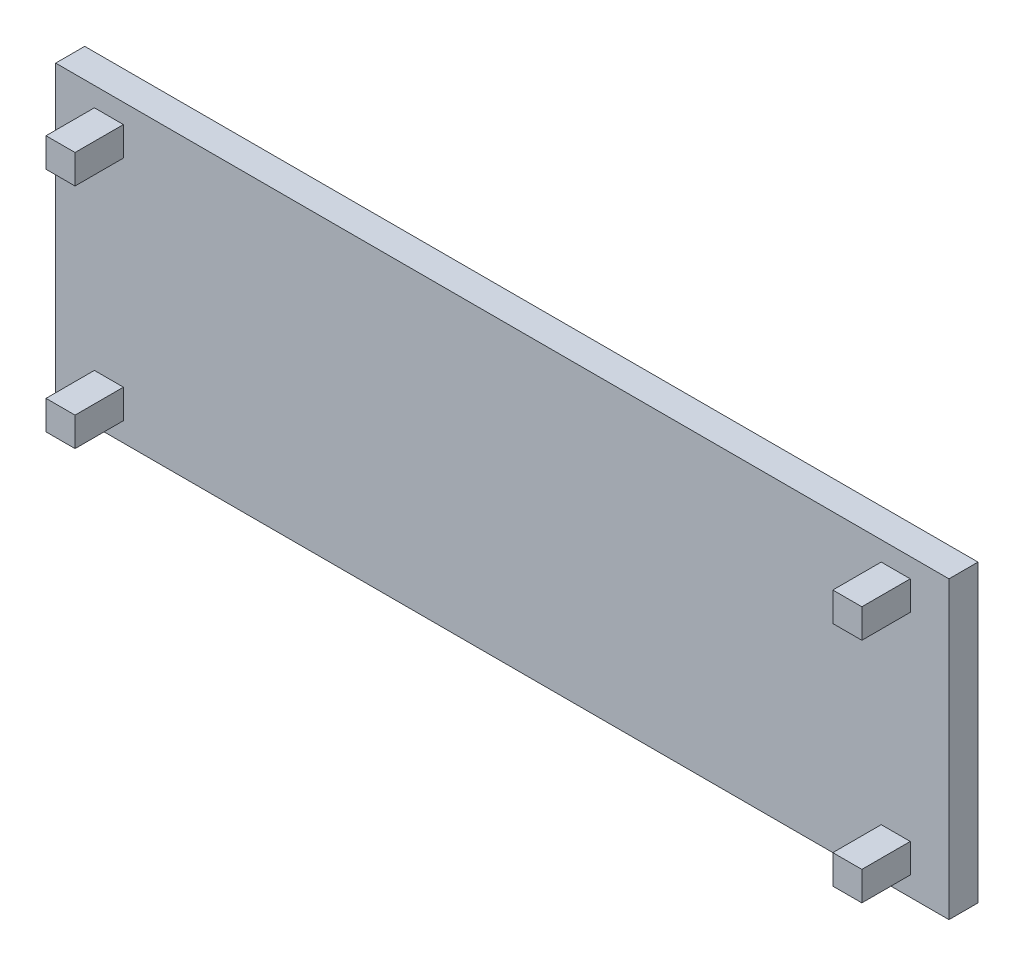
ISO-10303-21;
HEADER;
FILE_DESCRIPTION(('STEP AP214'),'2;1');
FILE_NAME('part.step','',(''),(''),'','','');
FILE_SCHEMA(('AUTOMOTIVE_DESIGN { 1 0 10303 214 1 1 1 1 }'));
ENDSEC;
DATA;
#1=APPLICATION_CONTEXT('core data for automotive mechanical design processes');
#2=APPLICATION_PROTOCOL_DEFINITION('international standard','automotive_design',2000,#1);
#3=PRODUCT_CONTEXT('',#1,'mechanical');
#4=PRODUCT('Part','Part','',(#3));
#5=PRODUCT_RELATED_PRODUCT_CATEGORY('part','',(#4));
#6=PRODUCT_DEFINITION_FORMATION('','',#4);
#7=PRODUCT_DEFINITION_CONTEXT('part definition',#1,'design');
#8=PRODUCT_DEFINITION('design','',#6,#7);
#9=PRODUCT_DEFINITION_SHAPE('','',#8);
#10=(LENGTH_UNIT() NAMED_UNIT(*) SI_UNIT(.MILLI.,.METRE.));
#11=(NAMED_UNIT(*) PLANE_ANGLE_UNIT() SI_UNIT($,.RADIAN.));
#12=(NAMED_UNIT(*) SI_UNIT($,.STERADIAN.) SOLID_ANGLE_UNIT());
#13=UNCERTAINTY_MEASURE_WITH_UNIT(LENGTH_MEASURE(1.E-05),#10,'distance_accuracy_value','');
#14=(GEOMETRIC_REPRESENTATION_CONTEXT(3) GLOBAL_UNCERTAINTY_ASSIGNED_CONTEXT((#13)) GLOBAL_UNIT_ASSIGNED_CONTEXT((#10,
#11,#12)) REPRESENTATION_CONTEXT('',''));
#15=CARTESIAN_POINT('',(0.,0.,0.));
#16=DIRECTION('',(0.,0.,1.));
#17=DIRECTION('',(1.,0.,0.));
#18=AXIS2_PLACEMENT_3D('',#15,#16,#17);
#19=CARTESIAN_POINT('',(0.,0.,3.));
#20=DIRECTION('',(0.,0.,1.));
#21=DIRECTION('',(1.,0.,0.));
#22=AXIS2_PLACEMENT_3D('',#19,#20,#21);
#23=PLANE('',#22);
#24=DIRECTION('',(0.,-1.,0.));
#25=VECTOR('',#24,1.);
#26=CARTESIAN_POINT('',(-46.15,0.,3.));
#27=LINE('',#26,#25);
#28=CARTESIAN_POINT('',(-46.15,15.85,3.));
#29=VERTEX_POINT('',#28);
#30=CARTESIAN_POINT('',(-46.15,-14.65,3.));
#31=VERTEX_POINT('',#30);
#32=EDGE_CURVE('E286',#29,#31,#27,.T.);
#33=ORIENTED_EDGE('',*,*,#32,.T.);
#34=DIRECTION('',(1.,0.,0.));
#35=VECTOR('',#34,1.);
#36=CARTESIAN_POINT('',(0.,-14.65,3.));
#37=LINE('',#36,#35);
#38=CARTESIAN_POINT('',(46.15,-14.65,3.));
#39=VERTEX_POINT('',#38);
#40=EDGE_CURVE('E289',#31,#39,#37,.T.);
#41=ORIENTED_EDGE('',*,*,#40,.T.);
#42=DIRECTION('',(0.,1.,0.));
#43=VECTOR('',#42,1.);
#44=CARTESIAN_POINT('',(46.15,0.,3.));
#45=LINE('',#44,#43);
#46=CARTESIAN_POINT('',(46.15,15.85,3.));
#47=VERTEX_POINT('',#46);
#48=EDGE_CURVE('E292',#39,#47,#45,.T.);
#49=ORIENTED_EDGE('',*,*,#48,.T.);
#50=DIRECTION('',(-1.,0.,0.));
#51=VECTOR('',#50,1.);
#52=CARTESIAN_POINT('',(0.,15.85,3.));
#53=LINE('',#52,#51);
#54=EDGE_CURVE('E294',#47,#29,#53,.T.);
#55=ORIENTED_EDGE('',*,*,#54,.T.);
#56=EDGE_LOOP('',(#33,#41,#49,#55));
#57=FACE_BOUND('',#56,.T.);
#58=DIRECTION('',(-1.,0.,0.));
#59=VECTOR('',#58,1.);
#60=CARTESIAN_POINT('',(42.15,-9.64999999999995,3.));
#61=LINE('',#60,#59);
#62=CARTESIAN_POINT('',(42.15,-9.64999999999995,3.));
#63=VERTEX_POINT('',#62);
#64=CARTESIAN_POINT('',(39.15,-9.64999999999995,3.));
#65=VERTEX_POINT('',#64);
#66=EDGE_CURVE('E270',#63,#65,#61,.T.);
#67=ORIENTED_EDGE('',*,*,#66,.F.);
#68=DIRECTION('',(0.,1.,0.));
#69=VECTOR('',#68,1.);
#70=CARTESIAN_POINT('',(42.15,-12.65,3.));
#71=LINE('',#70,#69);
#72=CARTESIAN_POINT('',(42.15,-12.65,3.));
#73=VERTEX_POINT('',#72);
#74=EDGE_CURVE('E256',#73,#63,#71,.T.);
#75=ORIENTED_EDGE('',*,*,#74,.F.);
#76=DIRECTION('',(1.,0.,0.));
#77=VECTOR('',#76,1.);
#78=CARTESIAN_POINT('',(42.15,-12.65,3.));
#79=LINE('',#78,#77);
#80=CARTESIAN_POINT('',(39.15,-12.65,3.));
#81=VERTEX_POINT('',#80);
#82=EDGE_CURVE('E261',#81,#73,#79,.T.);
#83=ORIENTED_EDGE('',*,*,#82,.F.);
#84=DIRECTION('',(0.,-1.,0.));
#85=VECTOR('',#84,1.);
#86=CARTESIAN_POINT('',(39.15,-12.65,3.));
#87=LINE('',#86,#85);
#88=EDGE_CURVE('E272',#65,#81,#87,.T.);
#89=ORIENTED_EDGE('',*,*,#88,.F.);
#90=EDGE_LOOP('',(#67,#75,#83,#89));
#91=FACE_BOUND('',#90,.T.);
#92=DIRECTION('',(1.,0.,0.));
#93=VECTOR('',#92,1.);
#94=CARTESIAN_POINT('',(-42.15,-12.65,3.));
#95=LINE('',#94,#93);
#96=CARTESIAN_POINT('',(-42.15,-12.65,3.));
#97=VERTEX_POINT('',#96);
#98=CARTESIAN_POINT('',(-39.15,-12.65,3.));
#99=VERTEX_POINT('',#98);
#100=EDGE_CURVE('E241',#97,#99,#95,.T.);
#101=ORIENTED_EDGE('',*,*,#100,.F.);
#102=DIRECTION('',(0.,-1.,0.));
#103=VECTOR('',#102,1.);
#104=CARTESIAN_POINT('',(-42.15,-12.65,3.));
#105=LINE('',#104,#103);
#106=CARTESIAN_POINT('',(-42.15,-9.64999999999996,3.));
#107=VERTEX_POINT('',#106);
#108=EDGE_CURVE('E227',#107,#97,#105,.T.);
#109=ORIENTED_EDGE('',*,*,#108,.F.);
#110=DIRECTION('',(-1.,0.,0.));
#111=VECTOR('',#110,1.);
#112=CARTESIAN_POINT('',(-42.15,-9.64999999999996,3.));
#113=LINE('',#112,#111);
#114=CARTESIAN_POINT('',(-39.15,-9.64999999999996,3.));
#115=VERTEX_POINT('',#114);
#116=EDGE_CURVE('E232',#115,#107,#113,.T.);
#117=ORIENTED_EDGE('',*,*,#116,.F.);
#118=DIRECTION('',(0.,1.,0.));
#119=VECTOR('',#118,1.);
#120=CARTESIAN_POINT('',(-39.15,-12.65,3.));
#121=LINE('',#120,#119);
#122=EDGE_CURVE('E243',#99,#115,#121,.T.);
#123=ORIENTED_EDGE('',*,*,#122,.F.);
#124=EDGE_LOOP('',(#101,#109,#117,#123));
#125=FACE_BOUND('',#124,.T.);
#126=DIRECTION('',(1.,0.,0.));
#127=VECTOR('',#126,1.);
#128=CARTESIAN_POINT('',(-42.15,10.85,3.));
#129=LINE('',#128,#127);
#130=CARTESIAN_POINT('',(-42.15,10.85,3.));
#131=VERTEX_POINT('',#130);
#132=CARTESIAN_POINT('',(-39.15,10.85,3.));
#133=VERTEX_POINT('',#132);
#134=EDGE_CURVE('E199',#131,#133,#129,.T.);
#135=ORIENTED_EDGE('',*,*,#134,.F.);
#136=DIRECTION('',(0.,-1.,0.));
#137=VECTOR('',#136,1.);
#138=CARTESIAN_POINT('',(-42.15,13.85,3.));
#139=LINE('',#138,#137);
#140=CARTESIAN_POINT('',(-42.15,13.85,3.));
#141=VERTEX_POINT('',#140);
#142=EDGE_CURVE('E196',#141,#131,#139,.T.);
#143=ORIENTED_EDGE('',*,*,#142,.F.);
#144=DIRECTION('',(-1.,0.,0.));
#145=VECTOR('',#144,1.);
#146=CARTESIAN_POINT('',(-42.15,13.85,3.));
#147=LINE('',#146,#145);
#148=CARTESIAN_POINT('',(-39.15,13.85,3.));
#149=VERTEX_POINT('',#148);
#150=EDGE_CURVE('E208',#149,#141,#147,.T.);
#151=ORIENTED_EDGE('',*,*,#150,.F.);
#152=DIRECTION('',(0.,1.,0.));
#153=VECTOR('',#152,1.);
#154=CARTESIAN_POINT('',(-39.15,13.85,3.));
#155=LINE('',#154,#153);
#156=EDGE_CURVE('E216',#133,#149,#155,.T.);
#157=ORIENTED_EDGE('',*,*,#156,.F.);
#158=EDGE_LOOP('',(#135,#143,#151,#157));
#159=FACE_BOUND('',#158,.T.);
#160=DIRECTION('',(-1.,0.,0.));
#161=VECTOR('',#160,1.);
#162=CARTESIAN_POINT('',(42.15,13.85,3.));
#163=LINE('',#162,#161);
#164=CARTESIAN_POINT('',(42.15,13.85,3.));
#165=VERTEX_POINT('',#164);
#166=CARTESIAN_POINT('',(39.15,13.85,3.));
#167=VERTEX_POINT('',#166);
#168=EDGE_CURVE('E557',#165,#167,#163,.T.);
#169=ORIENTED_EDGE('',*,*,#168,.F.);
#170=DIRECTION('',(0.,1.,0.));
#171=VECTOR('',#170,1.);
#172=CARTESIAN_POINT('',(42.15,13.85,3.));
#173=LINE('',#172,#171);
#174=CARTESIAN_POINT('',(42.15,10.85,3.));
#175=VERTEX_POINT('',#174);
#176=EDGE_CURVE('E194',#175,#165,#173,.T.);
#177=ORIENTED_EDGE('',*,*,#176,.F.);
#178=DIRECTION('',(1.,0.,0.));
#179=VECTOR('',#178,1.);
#180=CARTESIAN_POINT('',(42.15,10.85,3.));
#181=LINE('',#180,#179);
#182=CARTESIAN_POINT('',(39.15,10.85,3.));
#183=VERTEX_POINT('',#182);
#184=EDGE_CURVE('E190',#183,#175,#181,.T.);
#185=ORIENTED_EDGE('',*,*,#184,.F.);
#186=DIRECTION('',(0.,-1.,0.));
#187=VECTOR('',#186,1.);
#188=CARTESIAN_POINT('',(39.15,13.85,3.));
#189=LINE('',#188,#187);
#190=EDGE_CURVE('E554',#167,#183,#189,.T.);
#191=ORIENTED_EDGE('',*,*,#190,.F.);
#192=EDGE_LOOP('',(#169,#177,#185,#191));
#193=FACE_BOUND('',#192,.T.);
#194=ADVANCED_FACE('F33',(#57,#91,#125,#159,#193),#23,.T.);
#195=CARTESIAN_POINT('',(-46.15,0.,3.));
#196=DIRECTION('',(1.,0.,0.));
#197=DIRECTION('',(0.,0.,-1.));
#198=AXIS2_PLACEMENT_3D('',#195,#196,#197);
#199=PLANE('',#198);
#200=DIRECTION('',(0.,-1.,0.));
#201=VECTOR('',#200,1.);
#202=CARTESIAN_POINT('',(-46.15,0.,0.));
#203=LINE('',#202,#201);
#204=CARTESIAN_POINT('',(-46.15,15.85,0.));
#205=VERTEX_POINT('',#204);
#206=CARTESIAN_POINT('',(-46.15,-14.65,0.));
#207=VERTEX_POINT('',#206);
#208=EDGE_CURVE('E285',#205,#207,#203,.T.);
#209=ORIENTED_EDGE('',*,*,#208,.T.);
#210=DIRECTION('',(0.,0.,-1.));
#211=VECTOR('',#210,1.);
#212=CARTESIAN_POINT('',(-46.15,-14.65,3.));
#213=LINE('',#212,#211);
#214=EDGE_CURVE('E11',#31,#207,#213,.T.);
#215=ORIENTED_EDGE('',*,*,#214,.F.);
#216=ORIENTED_EDGE('',*,*,#32,.F.);
#217=DIRECTION('',(0.,0.,-1.));
#218=VECTOR('',#217,1.);
#219=CARTESIAN_POINT('',(-46.15,15.85,3.));
#220=LINE('',#219,#218);
#221=EDGE_CURVE('E296',#29,#205,#220,.T.);
#222=ORIENTED_EDGE('',*,*,#221,.T.);
#223=EDGE_LOOP('',(#209,#215,#216,#222));
#224=FACE_BOUND('',#223,.T.);
#225=ADVANCED_FACE('F35',(#224),#199,.F.);
#226=CARTESIAN_POINT('',(0.,-14.65,3.));
#227=DIRECTION('',(0.,1.,0.));
#228=DIRECTION('',(-1.,0.,0.));
#229=AXIS2_PLACEMENT_3D('',#226,#227,#228);
#230=PLANE('',#229);
#231=DIRECTION('',(1.,0.,0.));
#232=VECTOR('',#231,1.);
#233=CARTESIAN_POINT('',(0.,-14.65,0.));
#234=LINE('',#233,#232);
#235=CARTESIAN_POINT('',(46.15,-14.65,0.));
#236=VERTEX_POINT('',#235);
#237=EDGE_CURVE('E299',#207,#236,#234,.T.);
#238=ORIENTED_EDGE('',*,*,#237,.T.);
#239=DIRECTION('',(0.,0.,-1.));
#240=VECTOR('',#239,1.);
#241=CARTESIAN_POINT('',(46.15,-14.65,3.));
#242=LINE('',#241,#240);
#243=EDGE_CURVE('E41',#39,#236,#242,.T.);
#244=ORIENTED_EDGE('',*,*,#243,.F.);
#245=ORIENTED_EDGE('',*,*,#40,.F.);
#246=ORIENTED_EDGE('',*,*,#214,.T.);
#247=EDGE_LOOP('',(#238,#244,#245,#246));
#248=FACE_BOUND('',#247,.T.);
#249=ADVANCED_FACE('F329',(#248),#230,.F.);
#250=CARTESIAN_POINT('',(46.15,0.,3.));
#251=DIRECTION('',(-1.,0.,0.));
#252=DIRECTION('',(0.,-1.,0.));
#253=AXIS2_PLACEMENT_3D('',#250,#251,#252);
#254=PLANE('',#253);
#255=DIRECTION('',(0.,1.,0.));
#256=VECTOR('',#255,1.);
#257=CARTESIAN_POINT('',(46.15,0.,0.));
#258=LINE('',#257,#256);
#259=CARTESIAN_POINT('',(46.15,15.85,0.));
#260=VERTEX_POINT('',#259);
#261=EDGE_CURVE('E301',#236,#260,#258,.T.);
#262=ORIENTED_EDGE('',*,*,#261,.T.);
#263=DIRECTION('',(0.,0.,-1.));
#264=VECTOR('',#263,1.);
#265=CARTESIAN_POINT('',(46.15,15.85,3.));
#266=LINE('',#265,#264);
#267=EDGE_CURVE('E306',#47,#260,#266,.T.);
#268=ORIENTED_EDGE('',*,*,#267,.F.);
#269=ORIENTED_EDGE('',*,*,#48,.F.);
#270=ORIENTED_EDGE('',*,*,#243,.T.);
#271=EDGE_LOOP('',(#262,#268,#269,#270));
#272=FACE_BOUND('',#271,.T.);
#273=ADVANCED_FACE('F313',(#272),#254,.F.);
#274=CARTESIAN_POINT('',(0.,15.85,3.));
#275=DIRECTION('',(0.,-1.,0.));
#276=DIRECTION('',(0.,0.,-1.));
#277=AXIS2_PLACEMENT_3D('',#274,#275,#276);
#278=PLANE('',#277);
#279=DIRECTION('',(-1.,0.,0.));
#280=VECTOR('',#279,1.);
#281=CARTESIAN_POINT('',(0.,15.85,0.));
#282=LINE('',#281,#280);
#283=EDGE_CURVE('E290',#260,#205,#282,.T.);
#284=ORIENTED_EDGE('',*,*,#283,.T.);
#285=ORIENTED_EDGE('',*,*,#221,.F.);
#286=ORIENTED_EDGE('',*,*,#54,.F.);
#287=ORIENTED_EDGE('',*,*,#267,.T.);
#288=EDGE_LOOP('',(#284,#285,#286,#287));
#289=FACE_BOUND('',#288,.T.);
#290=ADVANCED_FACE('F322',(#289),#278,.F.);
#291=CARTESIAN_POINT('',(0.,0.,0.));
#292=DIRECTION('',(0.,0.,1.));
#293=DIRECTION('',(1.,0.,0.));
#294=AXIS2_PLACEMENT_3D('',#291,#292,#293);
#295=PLANE('',#294);
#296=ORIENTED_EDGE('',*,*,#208,.F.);
#297=ORIENTED_EDGE('',*,*,#283,.F.);
#298=ORIENTED_EDGE('',*,*,#261,.F.);
#299=ORIENTED_EDGE('',*,*,#237,.F.);
#300=EDGE_LOOP('',(#296,#297,#298,#299));
#301=FACE_BOUND('',#300,.T.);
#302=ADVANCED_FACE('F319',(#301),#295,.F.);
#303=CARTESIAN_POINT('',(42.15,-12.65,8.));
#304=DIRECTION('',(-1.,0.,0.));
#305=DIRECTION('',(0.,-1.,0.));
#306=AXIS2_PLACEMENT_3D('',#303,#304,#305);
#307=PLANE('',#306);
#308=ORIENTED_EDGE('',*,*,#74,.T.);
#309=DIRECTION('',(0.,0.,-1.));
#310=VECTOR('',#309,1.);
#311=CARTESIAN_POINT('',(42.15,-9.64999999999995,8.));
#312=LINE('',#311,#310);
#313=CARTESIAN_POINT('',(42.15,-9.64999999999995,8.));
#314=VERTEX_POINT('',#313);
#315=EDGE_CURVE('E283',#314,#63,#312,.T.);
#316=ORIENTED_EDGE('',*,*,#315,.F.);
#317=DIRECTION('',(0.,1.,0.));
#318=VECTOR('',#317,1.);
#319=CARTESIAN_POINT('',(42.15,-12.65,8.));
#320=LINE('',#319,#318);
#321=CARTESIAN_POINT('',(42.15,-12.65,8.));
#322=VERTEX_POINT('',#321);
#323=EDGE_CURVE('E257',#322,#314,#320,.T.);
#324=ORIENTED_EDGE('',*,*,#323,.F.);
#325=DIRECTION('',(0.,0.,-1.));
#326=VECTOR('',#325,1.);
#327=CARTESIAN_POINT('',(42.15,-12.65,8.));
#328=LINE('',#327,#326);
#329=EDGE_CURVE('E267',#322,#73,#328,.T.);
#330=ORIENTED_EDGE('',*,*,#329,.T.);
#331=EDGE_LOOP('',(#308,#316,#324,#330));
#332=FACE_BOUND('',#331,.T.);
#333=ADVANCED_FACE('F344',(#332),#307,.F.);
#334=CARTESIAN_POINT('',(42.15,-9.64999999999995,8.));
#335=DIRECTION('',(0.,-1.,0.));
#336=DIRECTION('',(1.,0.,0.));
#337=AXIS2_PLACEMENT_3D('',#334,#335,#336);
#338=PLANE('',#337);
#339=ORIENTED_EDGE('',*,*,#66,.T.);
#340=DIRECTION('',(0.,0.,-1.));
#341=VECTOR('',#340,1.);
#342=CARTESIAN_POINT('',(39.15,-9.64999999999995,8.));
#343=LINE('',#342,#341);
#344=CARTESIAN_POINT('',(39.15,-9.64999999999995,8.));
#345=VERTEX_POINT('',#344);
#346=EDGE_CURVE('E280',#345,#65,#343,.T.);
#347=ORIENTED_EDGE('',*,*,#346,.F.);
#348=DIRECTION('',(-1.,0.,0.));
#349=VECTOR('',#348,1.);
#350=CARTESIAN_POINT('',(42.15,-9.64999999999995,8.));
#351=LINE('',#350,#349);
#352=EDGE_CURVE('E260',#314,#345,#351,.T.);
#353=ORIENTED_EDGE('',*,*,#352,.F.);
#354=ORIENTED_EDGE('',*,*,#315,.T.);
#355=EDGE_LOOP('',(#339,#347,#353,#354));
#356=FACE_BOUND('',#355,.T.);
#357=ADVANCED_FACE('F366',(#356),#338,.F.);
#358=CARTESIAN_POINT('',(39.15,-12.65,8.));
#359=DIRECTION('',(1.,0.,0.));
#360=DIRECTION('',(0.,0.,-1.));
#361=AXIS2_PLACEMENT_3D('',#358,#359,#360);
#362=PLANE('',#361);
#363=ORIENTED_EDGE('',*,*,#88,.T.);
#364=DIRECTION('',(0.,0.,-1.));
#365=VECTOR('',#364,1.);
#366=CARTESIAN_POINT('',(39.15,-12.65,8.));
#367=LINE('',#366,#365);
#368=CARTESIAN_POINT('',(39.15,-12.65,8.));
#369=VERTEX_POINT('',#368);
#370=EDGE_CURVE('E278',#369,#81,#367,.T.);
#371=ORIENTED_EDGE('',*,*,#370,.F.);
#372=DIRECTION('',(0.,-1.,0.));
#373=VECTOR('',#372,1.);
#374=CARTESIAN_POINT('',(39.15,-12.65,8.));
#375=LINE('',#374,#373);
#376=EDGE_CURVE('E263',#345,#369,#375,.T.);
#377=ORIENTED_EDGE('',*,*,#376,.F.);
#378=ORIENTED_EDGE('',*,*,#346,.T.);
#379=EDGE_LOOP('',(#363,#371,#377,#378));
#380=FACE_BOUND('',#379,.T.);
#381=ADVANCED_FACE('F372',(#380),#362,.F.);
#382=CARTESIAN_POINT('',(42.15,-12.65,8.));
#383=DIRECTION('',(0.,1.,0.));
#384=DIRECTION('',(-1.,0.,0.));
#385=AXIS2_PLACEMENT_3D('',#382,#383,#384);
#386=PLANE('',#385);
#387=ORIENTED_EDGE('',*,*,#82,.T.);
#388=ORIENTED_EDGE('',*,*,#329,.F.);
#389=DIRECTION('',(1.,0.,0.));
#390=VECTOR('',#389,1.);
#391=CARTESIAN_POINT('',(42.15,-12.65,8.));
#392=LINE('',#391,#390);
#393=EDGE_CURVE('E265',#369,#322,#392,.T.);
#394=ORIENTED_EDGE('',*,*,#393,.F.);
#395=ORIENTED_EDGE('',*,*,#370,.T.);
#396=EDGE_LOOP('',(#387,#388,#394,#395));
#397=FACE_BOUND('',#396,.T.);
#398=ADVANCED_FACE('F379',(#397),#386,.F.);
#399=CARTESIAN_POINT('',(0.,0.,8.));
#400=DIRECTION('',(0.,0.,1.));
#401=DIRECTION('',(1.,0.,0.));
#402=AXIS2_PLACEMENT_3D('',#399,#400,#401);
#403=PLANE('',#402);
#404=ORIENTED_EDGE('',*,*,#323,.T.);
#405=ORIENTED_EDGE('',*,*,#352,.T.);
#406=ORIENTED_EDGE('',*,*,#376,.T.);
#407=ORIENTED_EDGE('',*,*,#393,.T.);
#408=EDGE_LOOP('',(#404,#405,#406,#407));
#409=FACE_BOUND('',#408,.T.);
#410=ADVANCED_FACE('F387',(#409),#403,.T.);
#411=CARTESIAN_POINT('',(-42.15,-12.65,8.));
#412=DIRECTION('',(1.,0.,0.));
#413=DIRECTION('',(0.,1.,0.));
#414=AXIS2_PLACEMENT_3D('',#411,#412,#413);
#415=PLANE('',#414);
#416=ORIENTED_EDGE('',*,*,#108,.T.);
#417=DIRECTION('',(0.,0.,-1.));
#418=VECTOR('',#417,1.);
#419=CARTESIAN_POINT('',(-42.15,-12.65,8.));
#420=LINE('',#419,#418);
#421=CARTESIAN_POINT('',(-42.15,-12.65,8.));
#422=VERTEX_POINT('',#421);
#423=EDGE_CURVE('E254',#422,#97,#420,.T.);
#424=ORIENTED_EDGE('',*,*,#423,.F.);
#425=DIRECTION('',(0.,-1.,0.));
#426=VECTOR('',#425,1.);
#427=CARTESIAN_POINT('',(-42.15,-12.65,8.));
#428=LINE('',#427,#426);
#429=CARTESIAN_POINT('',(-42.15,-9.64999999999996,8.));
#430=VERTEX_POINT('',#429);
#431=EDGE_CURVE('E228',#430,#422,#428,.T.);
#432=ORIENTED_EDGE('',*,*,#431,.F.);
#433=DIRECTION('',(0.,0.,-1.));
#434=VECTOR('',#433,1.);
#435=CARTESIAN_POINT('',(-42.15,-9.64999999999996,8.));
#436=LINE('',#435,#434);
#437=EDGE_CURVE('E238',#430,#107,#436,.T.);
#438=ORIENTED_EDGE('',*,*,#437,.T.);
#439=EDGE_LOOP('',(#416,#424,#432,#438));
#440=FACE_BOUND('',#439,.T.);
#441=ADVANCED_FACE('F395',(#440),#415,.F.);
#442=CARTESIAN_POINT('',(-42.15,-12.65,8.));
#443=DIRECTION('',(0.,1.,0.));
#444=DIRECTION('',(-1.,0.,0.));
#445=AXIS2_PLACEMENT_3D('',#442,#443,#444);
#446=PLANE('',#445);
#447=ORIENTED_EDGE('',*,*,#100,.T.);
#448=DIRECTION('',(0.,0.,-1.));
#449=VECTOR('',#448,1.);
#450=CARTESIAN_POINT('',(-39.15,-12.65,8.));
#451=LINE('',#450,#449);
#452=CARTESIAN_POINT('',(-39.15,-12.65,8.));
#453=VERTEX_POINT('',#452);
#454=EDGE_CURVE('E251',#453,#99,#451,.T.);
#455=ORIENTED_EDGE('',*,*,#454,.F.);
#456=DIRECTION('',(1.,0.,0.));
#457=VECTOR('',#456,1.);
#458=CARTESIAN_POINT('',(-42.15,-12.65,8.));
#459=LINE('',#458,#457);
#460=EDGE_CURVE('E231',#422,#453,#459,.T.);
#461=ORIENTED_EDGE('',*,*,#460,.F.);
#462=ORIENTED_EDGE('',*,*,#423,.T.);
#463=EDGE_LOOP('',(#447,#455,#461,#462));
#464=FACE_BOUND('',#463,.T.);
#465=ADVANCED_FACE('F403',(#464),#446,.F.);
#466=CARTESIAN_POINT('',(-39.15,-12.65,8.));
#467=DIRECTION('',(-1.,0.,0.));
#468=DIRECTION('',(0.,0.,1.));
#469=AXIS2_PLACEMENT_3D('',#466,#467,#468);
#470=PLANE('',#469);
#471=ORIENTED_EDGE('',*,*,#122,.T.);
#472=DIRECTION('',(0.,0.,-1.));
#473=VECTOR('',#472,1.);
#474=CARTESIAN_POINT('',(-39.15,-9.64999999999996,8.));
#475=LINE('',#474,#473);
#476=CARTESIAN_POINT('',(-39.15,-9.64999999999996,8.));
#477=VERTEX_POINT('',#476);
#478=EDGE_CURVE('E249',#477,#115,#475,.T.);
#479=ORIENTED_EDGE('',*,*,#478,.F.);
#480=DIRECTION('',(0.,1.,0.));
#481=VECTOR('',#480,1.);
#482=CARTESIAN_POINT('',(-39.15,-12.65,8.));
#483=LINE('',#482,#481);
#484=EDGE_CURVE('E234',#453,#477,#483,.T.);
#485=ORIENTED_EDGE('',*,*,#484,.F.);
#486=ORIENTED_EDGE('',*,*,#454,.T.);
#487=EDGE_LOOP('',(#471,#479,#485,#486));
#488=FACE_BOUND('',#487,.T.);
#489=ADVANCED_FACE('F411',(#488),#470,.F.);
#490=CARTESIAN_POINT('',(-42.15,-9.64999999999996,8.));
#491=DIRECTION('',(0.,-1.,0.));
#492=DIRECTION('',(0.,0.,-1.));
#493=AXIS2_PLACEMENT_3D('',#490,#491,#492);
#494=PLANE('',#493);
#495=ORIENTED_EDGE('',*,*,#116,.T.);
#496=ORIENTED_EDGE('',*,*,#437,.F.);
#497=DIRECTION('',(-1.,0.,0.));
#498=VECTOR('',#497,1.);
#499=CARTESIAN_POINT('',(-42.15,-9.64999999999996,8.));
#500=LINE('',#499,#498);
#501=EDGE_CURVE('E236',#477,#430,#500,.T.);
#502=ORIENTED_EDGE('',*,*,#501,.F.);
#503=ORIENTED_EDGE('',*,*,#478,.T.);
#504=EDGE_LOOP('',(#495,#496,#502,#503));
#505=FACE_BOUND('',#504,.T.);
#506=ADVANCED_FACE('F419',(#505),#494,.F.);
#507=CARTESIAN_POINT('',(0.,0.,8.));
#508=DIRECTION('',(0.,0.,-1.));
#509=DIRECTION('',(-1.,0.,0.));
#510=AXIS2_PLACEMENT_3D('',#507,#508,#509);
#511=PLANE('',#510);
#512=ORIENTED_EDGE('',*,*,#431,.T.);
#513=ORIENTED_EDGE('',*,*,#460,.T.);
#514=ORIENTED_EDGE('',*,*,#484,.T.);
#515=ORIENTED_EDGE('',*,*,#501,.T.);
#516=EDGE_LOOP('',(#512,#513,#514,#515));
#517=FACE_BOUND('',#516,.T.);
#518=ADVANCED_FACE('F427',(#517),#511,.F.);
#519=CARTESIAN_POINT('',(-42.15,13.85,8.));
#520=DIRECTION('',(1.,0.,0.));
#521=DIRECTION('',(0.,1.,0.));
#522=AXIS2_PLACEMENT_3D('',#519,#520,#521);
#523=PLANE('',#522);
#524=ORIENTED_EDGE('',*,*,#142,.T.);
#525=DIRECTION('',(0.,0.,-1.));
#526=VECTOR('',#525,1.);
#527=CARTESIAN_POINT('',(-42.15,10.85,8.));
#528=LINE('',#527,#526);
#529=CARTESIAN_POINT('',(-42.15,10.85,8.));
#530=VERTEX_POINT('',#529);
#531=EDGE_CURVE('E225',#530,#131,#528,.T.);
#532=ORIENTED_EDGE('',*,*,#531,.F.);
#533=DIRECTION('',(0.,-1.,0.));
#534=VECTOR('',#533,1.);
#535=CARTESIAN_POINT('',(-42.15,13.85,8.));
#536=LINE('',#535,#534);
#537=CARTESIAN_POINT('',(-42.15,13.85,8.));
#538=VERTEX_POINT('',#537);
#539=EDGE_CURVE('E204',#538,#530,#536,.T.);
#540=ORIENTED_EDGE('',*,*,#539,.F.);
#541=DIRECTION('',(0.,0.,-1.));
#542=VECTOR('',#541,1.);
#543=CARTESIAN_POINT('',(-42.15,13.85,8.));
#544=LINE('',#543,#542);
#545=EDGE_CURVE('E213',#538,#141,#544,.T.);
#546=ORIENTED_EDGE('',*,*,#545,.T.);
#547=EDGE_LOOP('',(#524,#532,#540,#546));
#548=FACE_BOUND('',#547,.T.);
#549=ADVANCED_FACE('F435',(#548),#523,.F.);
#550=CARTESIAN_POINT('',(-42.15,10.85,8.));
#551=DIRECTION('',(0.,1.,0.));
#552=DIRECTION('',(0.,0.,1.));
#553=AXIS2_PLACEMENT_3D('',#550,#551,#552);
#554=PLANE('',#553);
#555=ORIENTED_EDGE('',*,*,#134,.T.);
#556=DIRECTION('',(0.,0.,-1.));
#557=VECTOR('',#556,1.);
#558=CARTESIAN_POINT('',(-39.15,10.85,8.));
#559=LINE('',#558,#557);
#560=CARTESIAN_POINT('',(-39.15,10.85,8.));
#561=VERTEX_POINT('',#560);
#562=EDGE_CURVE('E222',#561,#133,#559,.T.);
#563=ORIENTED_EDGE('',*,*,#562,.F.);
#564=DIRECTION('',(1.,0.,0.));
#565=VECTOR('',#564,1.);
#566=CARTESIAN_POINT('',(-42.15,10.85,8.));
#567=LINE('',#566,#565);
#568=EDGE_CURVE('E207',#530,#561,#567,.T.);
#569=ORIENTED_EDGE('',*,*,#568,.F.);
#570=ORIENTED_EDGE('',*,*,#531,.T.);
#571=EDGE_LOOP('',(#555,#563,#569,#570));
#572=FACE_BOUND('',#571,.T.);
#573=ADVANCED_FACE('F443',(#572),#554,.F.);
#574=CARTESIAN_POINT('',(-39.15,13.85,8.));
#575=DIRECTION('',(-1.,0.,0.));
#576=DIRECTION('',(0.,0.,1.));
#577=AXIS2_PLACEMENT_3D('',#574,#575,#576);
#578=PLANE('',#577);
#579=ORIENTED_EDGE('',*,*,#156,.T.);
#580=DIRECTION('',(0.,0.,-1.));
#581=VECTOR('',#580,1.);
#582=CARTESIAN_POINT('',(-39.15,13.85,8.));
#583=LINE('',#582,#581);
#584=CARTESIAN_POINT('',(-39.15,13.85,8.));
#585=VERTEX_POINT('',#584);
#586=EDGE_CURVE('E56',#585,#149,#583,.T.);
#587=ORIENTED_EDGE('',*,*,#586,.F.);
#588=DIRECTION('',(0.,1.,0.));
#589=VECTOR('',#588,1.);
#590=CARTESIAN_POINT('',(-39.15,13.85,8.));
#591=LINE('',#590,#589);
#592=EDGE_CURVE('E210',#561,#585,#591,.T.);
#593=ORIENTED_EDGE('',*,*,#592,.F.);
#594=ORIENTED_EDGE('',*,*,#562,.T.);
#595=EDGE_LOOP('',(#579,#587,#593,#594));
#596=FACE_BOUND('',#595,.T.);
#597=ADVANCED_FACE('F451',(#596),#578,.F.);
#598=CARTESIAN_POINT('',(-42.15,13.85,8.));
#599=DIRECTION('',(0.,-1.,0.));
#600=DIRECTION('',(1.,0.,0.));
#601=AXIS2_PLACEMENT_3D('',#598,#599,#600);
#602=PLANE('',#601);
#603=ORIENTED_EDGE('',*,*,#150,.T.);
#604=ORIENTED_EDGE('',*,*,#545,.F.);
#605=DIRECTION('',(-1.,0.,0.));
#606=VECTOR('',#605,1.);
#607=CARTESIAN_POINT('',(-42.15,13.85,8.));
#608=LINE('',#607,#606);
#609=EDGE_CURVE('E212',#585,#538,#608,.T.);
#610=ORIENTED_EDGE('',*,*,#609,.F.);
#611=ORIENTED_EDGE('',*,*,#586,.T.);
#612=EDGE_LOOP('',(#603,#604,#610,#611));
#613=FACE_BOUND('',#612,.T.);
#614=ADVANCED_FACE('F459',(#613),#602,.F.);
#615=CARTESIAN_POINT('',(0.,0.,8.));
#616=DIRECTION('',(0.,0.,1.));
#617=DIRECTION('',(1.,0.,0.));
#618=AXIS2_PLACEMENT_3D('',#615,#616,#617);
#619=PLANE('',#618);
#620=ORIENTED_EDGE('',*,*,#539,.T.);
#621=ORIENTED_EDGE('',*,*,#568,.T.);
#622=ORIENTED_EDGE('',*,*,#592,.T.);
#623=ORIENTED_EDGE('',*,*,#609,.T.);
#624=EDGE_LOOP('',(#620,#621,#622,#623));
#625=FACE_BOUND('',#624,.T.);
#626=ADVANCED_FACE('F467',(#625),#619,.T.);
#627=CARTESIAN_POINT('',(42.15,13.85,8.));
#628=DIRECTION('',(-1.,0.,0.));
#629=DIRECTION('',(0.,-1.,0.));
#630=AXIS2_PLACEMENT_3D('',#627,#628,#629);
#631=PLANE('',#630);
#632=ORIENTED_EDGE('',*,*,#176,.T.);
#633=DIRECTION('',(0.,0.,-1.));
#634=VECTOR('',#633,1.);
#635=CARTESIAN_POINT('',(42.15,13.85,8.));
#636=LINE('',#635,#634);
#637=CARTESIAN_POINT('',(42.15,13.85,8.));
#638=VERTEX_POINT('',#637);
#639=EDGE_CURVE('E175',#638,#165,#636,.T.);
#640=ORIENTED_EDGE('',*,*,#639,.F.);
#641=DIRECTION('',(0.,1.,0.));
#642=VECTOR('',#641,1.);
#643=CARTESIAN_POINT('',(42.15,13.85,8.));
#644=LINE('',#643,#642);
#645=CARTESIAN_POINT('',(42.15,10.85,8.));
#646=VERTEX_POINT('',#645);
#647=EDGE_CURVE('E182',#646,#638,#644,.T.);
#648=ORIENTED_EDGE('',*,*,#647,.F.);
#649=DIRECTION('',(0.,0.,-1.));
#650=VECTOR('',#649,1.);
#651=CARTESIAN_POINT('',(42.15,10.85,8.));
#652=LINE('',#651,#650);
#653=EDGE_CURVE('E551',#646,#175,#652,.T.);
#654=ORIENTED_EDGE('',*,*,#653,.T.);
#655=EDGE_LOOP('',(#632,#640,#648,#654));
#656=FACE_BOUND('',#655,.T.);
#657=ADVANCED_FACE('F192',(#656),#631,.F.);
#658=CARTESIAN_POINT('',(42.15,13.85,8.));
#659=DIRECTION('',(0.,-1.,0.));
#660=DIRECTION('',(1.,0.,0.));
#661=AXIS2_PLACEMENT_3D('',#658,#659,#660);
#662=PLANE('',#661);
#663=ORIENTED_EDGE('',*,*,#168,.T.);
#664=DIRECTION('',(0.,0.,-1.));
#665=VECTOR('',#664,1.);
#666=CARTESIAN_POINT('',(39.15,13.85,8.));
#667=LINE('',#666,#665);
#668=CARTESIAN_POINT('',(39.15,13.85,8.));
#669=VERTEX_POINT('',#668);
#670=EDGE_CURVE('E178',#669,#167,#667,.T.);
#671=ORIENTED_EDGE('',*,*,#670,.F.);
#672=DIRECTION('',(-1.,0.,0.));
#673=VECTOR('',#672,1.);
#674=CARTESIAN_POINT('',(42.15,13.85,8.));
#675=LINE('',#674,#673);
#676=EDGE_CURVE('E171',#638,#669,#675,.T.);
#677=ORIENTED_EDGE('',*,*,#676,.F.);
#678=ORIENTED_EDGE('',*,*,#639,.T.);
#679=EDGE_LOOP('',(#663,#671,#677,#678));
#680=FACE_BOUND('',#679,.T.);
#681=ADVANCED_FACE('F173',(#680),#662,.F.);
#682=CARTESIAN_POINT('',(39.15,13.85,8.));
#683=DIRECTION('',(1.,0.,0.));
#684=DIRECTION('',(0.,0.,-1.));
#685=AXIS2_PLACEMENT_3D('',#682,#683,#684);
#686=PLANE('',#685);
#687=ORIENTED_EDGE('',*,*,#190,.T.);
#688=DIRECTION('',(0.,0.,-1.));
#689=VECTOR('',#688,1.);
#690=CARTESIAN_POINT('',(39.15,10.85,8.));
#691=LINE('',#690,#689);
#692=CARTESIAN_POINT('',(39.15,10.85,8.));
#693=VERTEX_POINT('',#692);
#694=EDGE_CURVE('E48',#693,#183,#691,.T.);
#695=ORIENTED_EDGE('',*,*,#694,.F.);
#696=DIRECTION('',(0.,-1.,0.));
#697=VECTOR('',#696,1.);
#698=CARTESIAN_POINT('',(39.15,13.85,8.));
#699=LINE('',#698,#697);
#700=EDGE_CURVE('E181',#669,#693,#699,.T.);
#701=ORIENTED_EDGE('',*,*,#700,.F.);
#702=ORIENTED_EDGE('',*,*,#670,.T.);
#703=EDGE_LOOP('',(#687,#695,#701,#702));
#704=FACE_BOUND('',#703,.T.);
#705=ADVANCED_FACE('F487',(#704),#686,.F.);
#706=CARTESIAN_POINT('',(42.15,10.85,8.));
#707=DIRECTION('',(0.,1.,0.));
#708=DIRECTION('',(0.,0.,1.));
#709=AXIS2_PLACEMENT_3D('',#706,#707,#708);
#710=PLANE('',#709);
#711=ORIENTED_EDGE('',*,*,#184,.T.);
#712=ORIENTED_EDGE('',*,*,#653,.F.);
#713=DIRECTION('',(1.,0.,0.));
#714=VECTOR('',#713,1.);
#715=CARTESIAN_POINT('',(42.15,10.85,8.));
#716=LINE('',#715,#714);
#717=EDGE_CURVE('E186',#693,#646,#716,.T.);
#718=ORIENTED_EDGE('',*,*,#717,.F.);
#719=ORIENTED_EDGE('',*,*,#694,.T.);
#720=EDGE_LOOP('',(#711,#712,#718,#719));
#721=FACE_BOUND('',#720,.T.);
#722=ADVANCED_FACE('F494',(#721),#710,.F.);
#723=CARTESIAN_POINT('',(0.,0.,8.));
#724=DIRECTION('',(0.,0.,-1.));
#725=DIRECTION('',(-1.,0.,0.));
#726=AXIS2_PLACEMENT_3D('',#723,#724,#725);
#727=PLANE('',#726);
#728=ORIENTED_EDGE('',*,*,#647,.T.);
#729=ORIENTED_EDGE('',*,*,#676,.T.);
#730=ORIENTED_EDGE('',*,*,#700,.T.);
#731=ORIENTED_EDGE('',*,*,#717,.T.);
#732=EDGE_LOOP('',(#728,#729,#730,#731));
#733=FACE_BOUND('',#732,.T.);
#734=ADVANCED_FACE('F185',(#733),#727,.F.);
#735=CLOSED_SHELL('',(#194,#225,#249,#273,#290,#302,#333,#357,#381,#398,#410,#441,#465,#489,
#506,#518,#549,#573,#597,#614,#626,#657,#681,#705,#722,#734));
#736=MANIFOLD_SOLID_BREP('B2',#735);
#737=ADVANCED_BREP_SHAPE_REPRESENTATION('',(#18,#736),#14);
#738=SHAPE_DEFINITION_REPRESENTATION(#9,#737);
ENDSEC;
END-ISO-10303-21;
